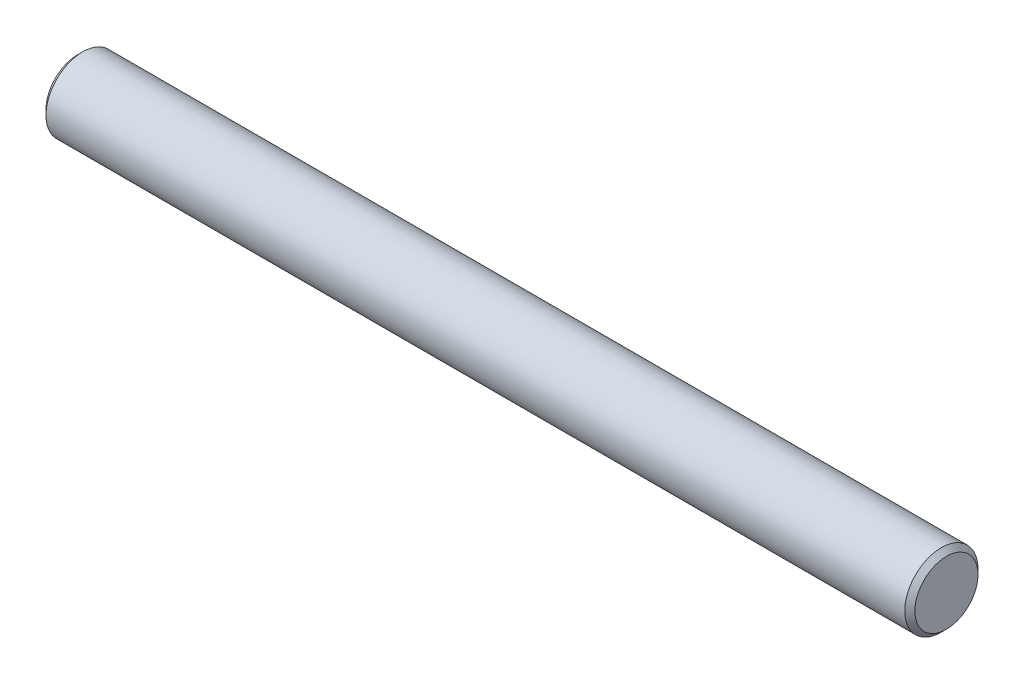
ISO-10303-21;
HEADER;
FILE_DESCRIPTION(('STEP AP214'),'2;1');
FILE_NAME('part.step','',(''),(''),'','','');
FILE_SCHEMA(('AUTOMOTIVE_DESIGN { 1 0 10303 214 1 1 1 1 }'));
ENDSEC;
DATA;
#1=APPLICATION_CONTEXT('core data for automotive mechanical design processes');
#2=APPLICATION_PROTOCOL_DEFINITION('international standard','automotive_design',2000,#1);
#3=PRODUCT_CONTEXT('',#1,'mechanical');
#4=PRODUCT('Part','Part','',(#3));
#5=PRODUCT_RELATED_PRODUCT_CATEGORY('part','',(#4));
#6=PRODUCT_DEFINITION_FORMATION('','',#4);
#7=PRODUCT_DEFINITION_CONTEXT('part definition',#1,'design');
#8=PRODUCT_DEFINITION('design','',#6,#7);
#9=PRODUCT_DEFINITION_SHAPE('','',#8);
#10=(LENGTH_UNIT() NAMED_UNIT(*) SI_UNIT(.MILLI.,.METRE.));
#11=(NAMED_UNIT(*) PLANE_ANGLE_UNIT() SI_UNIT($,.RADIAN.));
#12=(NAMED_UNIT(*) SI_UNIT($,.STERADIAN.) SOLID_ANGLE_UNIT());
#13=UNCERTAINTY_MEASURE_WITH_UNIT(LENGTH_MEASURE(1.E-05),#10,'distance_accuracy_value','');
#14=(GEOMETRIC_REPRESENTATION_CONTEXT(3) GLOBAL_UNCERTAINTY_ASSIGNED_CONTEXT((#13)) GLOBAL_UNIT_ASSIGNED_CONTEXT((#10,
#11,#12)) REPRESENTATION_CONTEXT('',''));
#15=CARTESIAN_POINT('',(0.,0.,0.));
#16=DIRECTION('',(0.,0.,1.));
#17=DIRECTION('',(1.,0.,0.));
#18=AXIS2_PLACEMENT_3D('',#15,#16,#17);
#19=CARTESIAN_POINT('',(17.2,0.,0.));
#20=DIRECTION('',(-1.,0.,0.));
#21=DIRECTION('',(0.,0.,1.));
#22=AXIS2_PLACEMENT_3D('',#19,#20,#21);
#23=CYLINDRICAL_SURFACE('',#22,1.45);
#24=CARTESIAN_POINT('',(17.,0.,0.));
#25=DIRECTION('',(1.,0.,0.));
#26=DIRECTION('',(0.,0.,-1.));
#27=AXIS2_PLACEMENT_3D('',#24,#25,#26);
#28=CIRCLE('',#27,1.45);
#29=CARTESIAN_POINT('',(17.,0.,1.45000000000001));
#30=VERTEX_POINT('',#29);
#31=EDGE_CURVE('E42',#30,#30,#28,.F.);
#32=CARTESIAN_POINT('',(-17.,0.,0.));
#33=DIRECTION('',(1.,0.,0.));
#34=DIRECTION('',(0.,0.,-1.));
#35=AXIS2_PLACEMENT_3D('',#32,#33,#34);
#36=CIRCLE('',#35,1.45);
#37=CARTESIAN_POINT('',(-17.,0.,1.45000000000001));
#38=VERTEX_POINT('',#37);
#39=EDGE_CURVE('E48',#38,#38,#36,.T.);
#40=CARTESIAN_POINT('',(17.,0.,1.45000000000001));
#41=CARTESIAN_POINT('',(16.6458333333334,0.,1.45000000000001));
#42=CARTESIAN_POINT('',(16.2916666666667,0.,1.45000000000001));
#43=CARTESIAN_POINT('',(15.5833333333334,0.,1.45000000000001));
#44=CARTESIAN_POINT('',(15.2291666666667,0.,1.45000000000001));
#45=CARTESIAN_POINT('',(14.5208333333334,0.,1.45000000000001));
#46=CARTESIAN_POINT('',(14.1666666666667,0.,1.45000000000001));
#47=CARTESIAN_POINT('',(13.4583333333334,0.,1.45000000000001));
#48=CARTESIAN_POINT('',(13.1041666666667,0.,1.45000000000001));
#49=CARTESIAN_POINT('',(12.3958333333334,0.,1.45000000000001));
#50=CARTESIAN_POINT('',(12.0416666666667,0.,1.45000000000001));
#51=CARTESIAN_POINT('',(11.3333333333334,0.,1.45000000000001));
#52=CARTESIAN_POINT('',(10.9791666666667,0.,1.45000000000001));
#53=CARTESIAN_POINT('',(10.2708333333334,0.,1.45000000000001));
#54=CARTESIAN_POINT('',(9.91666666666669,0.,1.45000000000001));
#55=CARTESIAN_POINT('',(9.20833333333336,0.,1.45000000000001));
#56=CARTESIAN_POINT('',(8.85416666666669,0.,1.45000000000001));
#57=CARTESIAN_POINT('',(8.14583333333335,0.,1.45000000000001));
#58=CARTESIAN_POINT('',(7.79166666666669,0.,1.45000000000001));
#59=CARTESIAN_POINT('',(7.08333333333335,0.,1.45000000000001));
#60=CARTESIAN_POINT('',(6.72916666666669,0.,1.45000000000001));
#61=CARTESIAN_POINT('',(6.02083333333335,0.,1.45000000000001));
#62=CARTESIAN_POINT('',(5.66666666666669,0.,1.45000000000001));
#63=CARTESIAN_POINT('',(4.95833333333335,0.,1.45000000000001));
#64=CARTESIAN_POINT('',(4.60416666666669,0.,1.45000000000001));
#65=CARTESIAN_POINT('',(3.89583333333335,0.,1.45000000000001));
#66=CARTESIAN_POINT('',(3.54166666666669,0.,1.45000000000001));
#67=CARTESIAN_POINT('',(2.83333333333335,0.,1.45000000000001));
#68=CARTESIAN_POINT('',(2.47916666666669,0.,1.45000000000001));
#69=CARTESIAN_POINT('',(1.77083333333335,0.,1.45000000000001));
#70=CARTESIAN_POINT('',(1.41666666666669,0.,1.45000000000001));
#71=CARTESIAN_POINT('',(0.708333333333351,0.,1.45000000000001));
#72=CARTESIAN_POINT('',(0.354166666666684,0.,1.45000000000001));
#73=CARTESIAN_POINT('',(-0.35416666666665,0.,1.45000000000001));
#74=CARTESIAN_POINT('',(-0.708333333333317,0.,1.45000000000001));
#75=CARTESIAN_POINT('',(-1.41666666666665,0.,1.45000000000001));
#76=CARTESIAN_POINT('',(-1.77083333333332,0.,1.45000000000001));
#77=CARTESIAN_POINT('',(-2.47916666666665,0.,1.45000000000001));
#78=CARTESIAN_POINT('',(-2.83333333333332,0.,1.45000000000001));
#79=CARTESIAN_POINT('',(-3.54166666666665,0.,1.45000000000001));
#80=CARTESIAN_POINT('',(-3.89583333333332,0.,1.45000000000001));
#81=CARTESIAN_POINT('',(-4.60416666666665,0.,1.45000000000001));
#82=CARTESIAN_POINT('',(-4.95833333333332,0.,1.45000000000001));
#83=CARTESIAN_POINT('',(-5.66666666666665,0.,1.45000000000001));
#84=CARTESIAN_POINT('',(-6.02083333333331,0.,1.45000000000001));
#85=CARTESIAN_POINT('',(-6.72916666666665,0.,1.45000000000001));
#86=CARTESIAN_POINT('',(-7.08333333333332,0.,1.45000000000001));
#87=CARTESIAN_POINT('',(-7.79166666666665,0.,1.45000000000001));
#88=CARTESIAN_POINT('',(-8.14583333333332,0.,1.45000000000001));
#89=CARTESIAN_POINT('',(-8.85416666666665,0.,1.45000000000001));
#90=CARTESIAN_POINT('',(-9.20833333333332,0.,1.45000000000001));
#91=CARTESIAN_POINT('',(-9.91666666666665,0.,1.45000000000001));
#92=CARTESIAN_POINT('',(-10.2708333333333,0.,1.45000000000001));
#93=CARTESIAN_POINT('',(-10.9791666666667,0.,1.45000000000001));
#94=CARTESIAN_POINT('',(-11.3333333333333,0.,1.45000000000001));
#95=CARTESIAN_POINT('',(-12.0416666666667,0.,1.45000000000001));
#96=CARTESIAN_POINT('',(-12.3958333333333,0.,1.45000000000001));
#97=CARTESIAN_POINT('',(-13.1041666666667,0.,1.45000000000001));
#98=CARTESIAN_POINT('',(-13.4583333333333,0.,1.45000000000001));
#99=CARTESIAN_POINT('',(-14.1666666666667,0.,1.45000000000001));
#100=CARTESIAN_POINT('',(-14.5208333333333,0.,1.45000000000001));
#101=CARTESIAN_POINT('',(-15.2291666666667,0.,1.45000000000001));
#102=CARTESIAN_POINT('',(-15.5833333333333,0.,1.45000000000001));
#103=CARTESIAN_POINT('',(-16.2916666666667,0.,1.45000000000001));
#104=CARTESIAN_POINT('',(-16.6458333333333,0.,1.45000000000001));
#105=CARTESIAN_POINT('',(-17.,0.,1.45000000000001));
#106=B_SPLINE_CURVE_WITH_KNOTS('',3,(#40,#41,#42,#43,#44,#45,#46,#47,#48,#49,#50,#51,#52,#53,
#54,#55,#56,#57,#58,#59,#60,#61,#62,#63,#64,#65,#66,#67,#68,#69,#70,#71,#72,#73,#74,#75,#76,#77,
#78,#79,#80,#81,#82,#83,#84,#85,#86,#87,#88,#89,#90,#91,#92,#93,#94,#95,#96,#97,#98,#99,#100,
#101,#102,#103,#104,#105),.UNSPECIFIED.,.F.,.F.,(4,2,2,2,2,2,2,2,2,2,2,2,2,2,2,2,2,2,2,2,2,2,2,
2,2,2,2,2,2,2,2,2,4),(0.,1.0625,2.125,3.1875,4.25,5.3125,6.375,7.4375,8.5,9.56250000000001,
10.625,11.6875,12.75,13.8125,14.875,15.9375,17.,18.0625,19.125,20.1875,21.25,22.3125,23.375,
24.4375,25.5,26.5625,27.625,28.6875,29.75,30.8125,31.875,32.9375,34.),.UNSPECIFIED.);
#107=EDGE_CURVE('BSEAM34',#30,#38,#106,.T.);
#108=ORIENTED_EDGE('',*,*,#31,.T.);
#109=ORIENTED_EDGE('',*,*,#39,.T.);
#110=ORIENTED_EDGE('',*,*,#107,.T.);
#111=ORIENTED_EDGE('',*,*,#107,.F.);
#112=EDGE_LOOP('',(#108,#110,#109,#111));
#113=FACE_BOUND('',#112,.T.);
#114=ADVANCED_FACE('F34',(#113),#23,.T.);
#115=CARTESIAN_POINT('',(17.2,0.,0.));
#116=DIRECTION('',(1.,0.,0.));
#117=DIRECTION('',(0.,0.,-1.));
#118=AXIS2_PLACEMENT_3D('',#115,#116,#117);
#119=PLANE('',#118);
#120=CARTESIAN_POINT('',(17.2,0.,0.));
#121=DIRECTION('',(1.,0.,0.));
#122=DIRECTION('',(0.,0.,-1.));
#123=AXIS2_PLACEMENT_3D('',#120,#121,#122);
#124=CIRCLE('',#123,1.25000000000003);
#125=CARTESIAN_POINT('',(17.2,0.,-1.25000000000003));
#126=VERTEX_POINT('',#125);
#127=EDGE_CURVE('E54',#126,#126,#124,.T.);
#128=ORIENTED_EDGE('',*,*,#127,.T.);
#129=EDGE_LOOP('',(#128));
#130=FACE_BOUND('',#129,.T.);
#131=ADVANCED_FACE('F62',(#130),#119,.T.);
#132=CARTESIAN_POINT('',(-17.2,0.,0.));
#133=DIRECTION('',(1.,0.,0.));
#134=DIRECTION('',(0.,0.,-1.));
#135=AXIS2_PLACEMENT_3D('',#132,#133,#134);
#136=PLANE('',#135);
#137=CARTESIAN_POINT('',(-17.2,0.,0.));
#138=DIRECTION('',(1.,0.,0.));
#139=DIRECTION('',(0.,0.,-1.));
#140=AXIS2_PLACEMENT_3D('',#137,#138,#139);
#141=CIRCLE('',#140,1.24999999999997);
#142=CARTESIAN_POINT('',(-17.2,0.,-1.24999999999998));
#143=VERTEX_POINT('',#142);
#144=EDGE_CURVE('E10',#143,#143,#141,.F.);
#145=ORIENTED_EDGE('',*,*,#144,.T.);
#146=EDGE_LOOP('',(#145));
#147=FACE_BOUND('',#146,.T.);
#148=ADVANCED_FACE('F66',(#147),#136,.F.);
#149=CARTESIAN_POINT('',(17.2,0.,0.));
#150=DIRECTION('',(-1.,0.,0.));
#151=DIRECTION('',(0.,0.,1.));
#152=AXIS2_PLACEMENT_3D('',#149,#150,#151);
#153=CONICAL_SURFACE('',#152,1.25000000000003,0.78539816339744);
#154=ORIENTED_EDGE('',*,*,#31,.F.);
#155=EDGE_LOOP('',(#154));
#156=FACE_BOUND('',#155,.T.);
#157=ORIENTED_EDGE('',*,*,#127,.F.);
#158=EDGE_LOOP('',(#157));
#159=FACE_BOUND('',#158,.T.);
#160=ADVANCED_FACE('F64',(#156,#159),#153,.T.);
#161=CARTESIAN_POINT('',(-17.,0.,0.));
#162=DIRECTION('',(1.,0.,0.));
#163=DIRECTION('',(0.,0.,-1.));
#164=AXIS2_PLACEMENT_3D('',#161,#162,#163);
#165=CONICAL_SURFACE('',#164,1.45,0.785398163397466);
#166=ORIENTED_EDGE('',*,*,#144,.F.);
#167=EDGE_LOOP('',(#166));
#168=FACE_BOUND('',#167,.T.);
#169=ORIENTED_EDGE('',*,*,#39,.F.);
#170=EDGE_LOOP('',(#169));
#171=FACE_BOUND('',#170,.T.);
#172=ADVANCED_FACE('F36',(#168,#171),#165,.T.);
#173=CLOSED_SHELL('',(#114,#131,#148,#160,#172));
#174=MANIFOLD_SOLID_BREP('B2',#173);
#175=ADVANCED_BREP_SHAPE_REPRESENTATION('',(#18,#174),#14);
#176=SHAPE_DEFINITION_REPRESENTATION(#9,#175);
ENDSEC;
END-ISO-10303-21;
